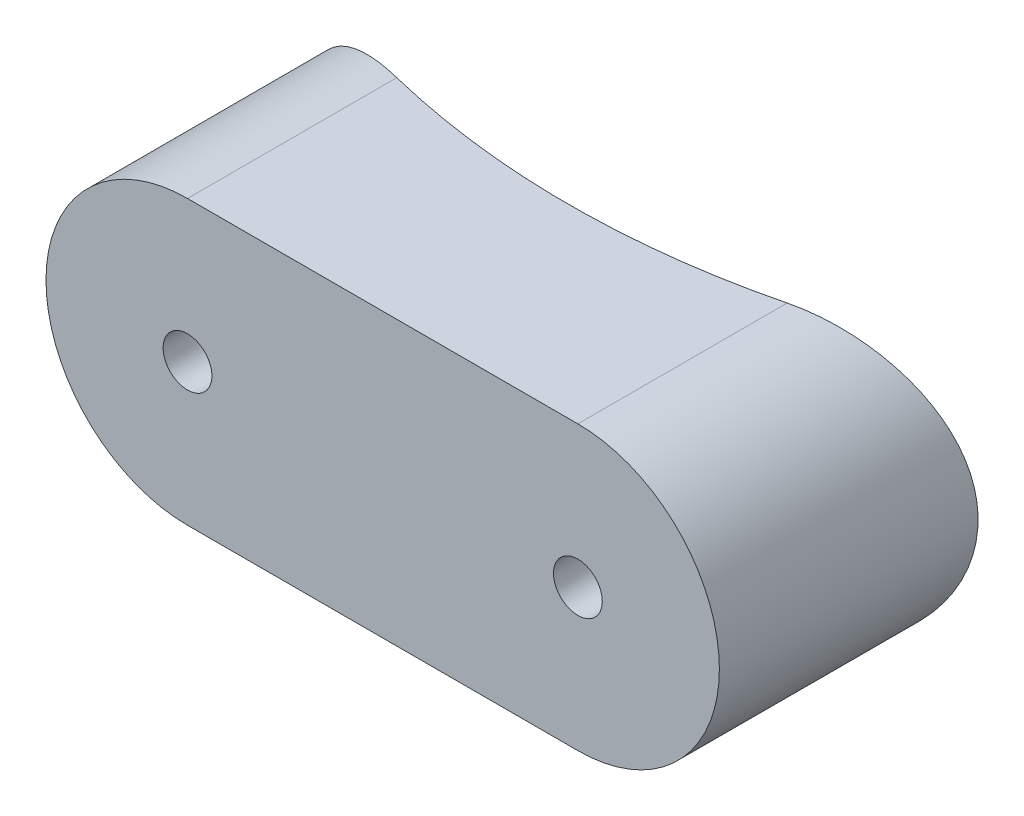
ISO-10303-21;
HEADER;
FILE_DESCRIPTION(('STEP AP214'),'2;1');
FILE_NAME('part.step','',(''),(''),'','','');
FILE_SCHEMA(('AUTOMOTIVE_DESIGN { 1 0 10303 214 1 1 1 1 }'));
ENDSEC;
DATA;
#1=APPLICATION_CONTEXT('core data for automotive mechanical design processes');
#2=APPLICATION_PROTOCOL_DEFINITION('international standard','automotive_design',2000,#1);
#3=PRODUCT_CONTEXT('',#1,'mechanical');
#4=PRODUCT('Part','Part','',(#3));
#5=PRODUCT_RELATED_PRODUCT_CATEGORY('part','',(#4));
#6=PRODUCT_DEFINITION_FORMATION('','',#4);
#7=PRODUCT_DEFINITION_CONTEXT('part definition',#1,'design');
#8=PRODUCT_DEFINITION('design','',#6,#7);
#9=PRODUCT_DEFINITION_SHAPE('','',#8);
#10=(LENGTH_UNIT() NAMED_UNIT(*) SI_UNIT(.MILLI.,.METRE.));
#11=(NAMED_UNIT(*) PLANE_ANGLE_UNIT() SI_UNIT($,.RADIAN.));
#12=(NAMED_UNIT(*) SI_UNIT($,.STERADIAN.) SOLID_ANGLE_UNIT());
#13=UNCERTAINTY_MEASURE_WITH_UNIT(LENGTH_MEASURE(1.E-05),#10,'distance_accuracy_value','');
#14=(GEOMETRIC_REPRESENTATION_CONTEXT(3) GLOBAL_UNCERTAINTY_ASSIGNED_CONTEXT((#13)) GLOBAL_UNIT_ASSIGNED_CONTEXT((#10,
#11,#12)) REPRESENTATION_CONTEXT('',''));
#15=CARTESIAN_POINT('',(0.,0.,0.));
#16=DIRECTION('',(0.,0.,1.));
#17=DIRECTION('',(1.,0.,0.));
#18=AXIS2_PLACEMENT_3D('',#15,#16,#17);
#19=CARTESIAN_POINT('',(0.,-1.15242426578704,68.));
#20=DIRECTION('',(0.,1.,0.));
#21=DIRECTION('',(-1.,0.,0.));
#22=AXIS2_PLACEMENT_3D('',#19,#20,#21);
#23=PLANE('',#22);
#24=CARTESIAN_POINT('',(0.,-1.15242426578704,31.));
#25=DIRECTION('',(0.,1.,0.));
#26=DIRECTION('',(-1.,0.,0.));
#27=AXIS2_PLACEMENT_3D('',#24,#25,#26);
#28=CIRCLE('',#27,41.5);
#29=CARTESIAN_POINT('',(9.99999999999999,-1.15242426578704,71.2771647462926));
#30=VERTEX_POINT('',#29);
#31=CARTESIAN_POINT('',(-10.,-1.15242426578704,71.2771647462926));
#32=VERTEX_POINT('',#31);
#33=EDGE_CURVE('E138',#30,#32,#28,.F.);
#34=ORIENTED_EDGE('',*,*,#33,.T.);
#35=DIRECTION('',(0.,0.,1.));
#36=VECTOR('',#35,1.);
#37=CARTESIAN_POINT('',(-10.,-1.15242426578704,68.));
#38=LINE('',#37,#36);
#39=CARTESIAN_POINT('',(-10.,-1.15242426578704,82.));
#40=VERTEX_POINT('',#39);
#41=EDGE_CURVE('E192',#32,#40,#38,.T.);
#42=ORIENTED_EDGE('',*,*,#41,.T.);
#43=DIRECTION('',(-1.,0.,0.));
#44=VECTOR('',#43,1.);
#45=CARTESIAN_POINT('',(10.,-1.15242426578704,82.));
#46=LINE('',#45,#44);
#47=CARTESIAN_POINT('',(10.,-1.15242426578704,82.));
#48=VERTEX_POINT('',#47);
#49=EDGE_CURVE('E121',#48,#40,#46,.T.);
#50=ORIENTED_EDGE('',*,*,#49,.F.);
#51=DIRECTION('',(0.,0.,1.));
#52=VECTOR('',#51,1.);
#53=CARTESIAN_POINT('',(10.,-1.15242426578704,68.));
#54=LINE('',#53,#52);
#55=EDGE_CURVE('E48',#30,#48,#54,.T.);
#56=ORIENTED_EDGE('',*,*,#55,.F.);
#57=EDGE_LOOP('',(#34,#42,#50,#56));
#58=FACE_BOUND('',#57,.T.);
#59=ADVANCED_FACE('F34',(#58),#23,.T.);
#60=CARTESIAN_POINT('',(9.99999999999999,-8.40242426578704,68.));
#61=DIRECTION('',(0.,0.,1.));
#62=DIRECTION('',(1.,0.,0.));
#63=AXIS2_PLACEMENT_3D('',#60,#61,#62);
#64=CYLINDRICAL_SURFACE('',#63,7.25);
#65=CARTESIAN_POINT('',(10.,-1.15242426578704,71.2771647462927));
#66=CARTESIAN_POINT('',(10.2124891817823,-1.1524052475028,71.2244258138282));
#67=CARTESIAN_POINT('',(10.4245300534251,-1.16176467058222,71.1699780892258));
#68=CARTESIAN_POINT('',(10.846172520077,-1.19886996710518,71.0581791388874));
#69=CARTESIAN_POINT('',(11.0557746928388,-1.22661139153719,71.000828618819));
#70=CARTESIAN_POINT('',(11.4708355233576,-1.30006355841646,70.8837871214166));
#71=CARTESIAN_POINT('',(11.6762991420345,-1.34575125151986,70.8240992342674));
#72=CARTESIAN_POINT('',(12.0819925737332,-1.45462501654705,70.7028997959157));
#73=CARTESIAN_POINT('',(12.2822221393194,-1.51781191410006,70.6413881587891));
#74=CARTESIAN_POINT('',(12.6759980911815,-1.66110354254626,70.517232615764));
#75=CARTESIAN_POINT('',(12.869548964468,-1.74119664715344,70.454589514899));
#76=CARTESIAN_POINT('',(13.2489476422076,-1.91777803441309,70.328810608568));
#77=CARTESIAN_POINT('',(13.4347925931693,-2.01427232413283,70.2656746306941));
#78=CARTESIAN_POINT('',(13.7975119153194,-2.22300796626837,70.1396924761351));
#79=CARTESIAN_POINT('',(13.9743866395916,-2.33524869822083,70.0768462881318));
#80=CARTESIAN_POINT('',(14.3180807913136,-2.57485376994829,69.9522270543036));
#81=CARTESIAN_POINT('',(14.4848967195176,-2.702223327485,69.8904543871931));
#82=CARTESIAN_POINT('',(14.8097802864001,-2.97342981741409,69.7679122347063));
#83=CARTESIAN_POINT('',(14.9676716498176,-3.11749193201401,69.7071732652072));
#84=CARTESIAN_POINT('',(15.2706547887871,-3.41960749195312,69.5886456009891));
#85=CARTESIAN_POINT('',(15.4157471170657,-3.57766033251136,69.5308567789133));
#86=CARTESIAN_POINT('',(15.6919781532452,-3.90686420682692,69.4191882406814));
#87=CARTESIAN_POINT('',(15.8231145621534,-4.07801739067678,69.3653091690517));
#88=CARTESIAN_POINT('',(16.0701655367582,-4.43226132057345,69.2624839907073));
#89=CARTESIAN_POINT('',(16.1860872215626,-4.61534642311868,69.2135355794027));
#90=CARTESIAN_POINT('',(16.3974116820319,-4.98494612853372,69.1233206528766));
#91=CARTESIAN_POINT('',(16.4934379870788,-5.1710491116763,69.0818291259539));
#92=CARTESIAN_POINT('',(16.6693917810856,-5.5518661326906,69.0051390208299));
#93=CARTESIAN_POINT('',(16.7493268602946,-5.74657605754737,68.9699374765216));
#94=CARTESIAN_POINT('',(16.8922167158571,-6.14316424865638,68.9065842268932));
#95=CARTESIAN_POINT('',(16.9551779510032,-6.34503975511669,68.8784298403206));
#96=CARTESIAN_POINT('',(17.0633762528942,-6.75438868767839,68.8298125767539));
#97=CARTESIAN_POINT('',(17.1086148384099,-6.96186163246891,68.8093490406862));
#98=CARTESIAN_POINT('',(17.1777516790101,-7.36305814135954,68.7779851047201));
#99=CARTESIAN_POINT('',(17.2031196399261,-7.55647835492858,68.7664274319373));
#100=CARTESIAN_POINT('',(17.2381852250226,-7.94502302472115,68.7504350506935));
#101=CARTESIAN_POINT('',(17.2478837866182,-8.14014737829303,68.7459999161299));
#102=CARTESIAN_POINT('',(17.2514953912304,-8.53052418792687,68.7443493766336));
#103=CARTESIAN_POINT('',(17.2454122122275,-8.72577660214531,68.7471322437882));
#104=CARTESIAN_POINT('',(17.2175410956554,-9.1149201876528,68.7598531900403));
#105=CARTESIAN_POINT('',(17.1957533938531,-9.30881137933332,68.7697911617206));
#106=CARTESIAN_POINT('',(17.1381385389307,-9.68455890977418,68.7959674062172));
#107=CARTESIAN_POINT('',(17.1030295741955,-9.86654857923512,68.8118830226414));
#108=CARTESIAN_POINT('',(17.0191490206092,-10.2267755474764,68.8497117791416));
#109=CARTESIAN_POINT('',(16.9703729869442,-10.4050116051952,68.8716268703177));
#110=CARTESIAN_POINT('',(16.8596523432354,-10.7564869432642,68.9210468282442));
#111=CARTESIAN_POINT('',(16.7977113859955,-10.9297275945526,68.9485501443655));
#112=CARTESIAN_POINT('',(16.6611892077152,-11.2703034932898,69.0086876349375));
#113=CARTESIAN_POINT('',(16.5866031832467,-11.4376364673199,69.041323758824));
#114=CARTESIAN_POINT('',(16.4226819700281,-11.7710030141406,69.1123833234679));
#115=CARTESIAN_POINT('',(16.3329307670603,-11.9367979677166,69.1509660873253));
#116=CARTESIAN_POINT('',(16.1412963576596,-12.2601854143652,69.2324389994661));
#117=CARTESIAN_POINT('',(16.0394086968998,-12.417774865166,69.2753307283172));
#118=CARTESIAN_POINT('',(15.8243009356617,-12.7238832333189,69.3647632729127));
#119=CARTESIAN_POINT('',(15.7110823788812,-12.8724033818266,69.4113035913943));
#120=CARTESIAN_POINT('',(15.4740310256327,-13.1597545157016,69.50741130914));
#121=CARTESIAN_POINT('',(15.3501944251626,-13.2985819960015,69.556979791425));
#122=CARTESIAN_POINT('',(15.0824218732578,-13.5765563185708,69.6625513270256));
#123=CARTESIAN_POINT('',(14.9376705731811,-13.7148434663978,69.7187521291568));
#124=CARTESIAN_POINT('',(14.6376921024194,-13.978642704076,69.833152570911));
#125=CARTESIAN_POINT('',(14.4824643174489,-14.1041540437374,69.8913523276436));
#126=CARTESIAN_POINT('',(14.1623833022844,-14.3418546385156,70.0090501418277));
#127=CARTESIAN_POINT('',(13.9975226381263,-14.4540333964279,70.0685491791903));
#128=CARTESIAN_POINT('',(13.6593263820418,-14.6643305992505,70.1880716415349));
#129=CARTESIAN_POINT('',(13.4859933563997,-14.7624532667951,70.2480949032597));
#130=CARTESIAN_POINT('',(13.1210603262547,-14.9496407839121,70.371653388522));
#131=CARTESIAN_POINT('',(12.9289900020856,-15.0377954884341,70.4351808482796));
#132=CARTESIAN_POINT('',(12.5377043388218,-15.1970661849329,70.5613221082055));
#133=CARTESIAN_POINT('',(12.3384914734198,-15.268188011647,70.6239362143276));
#134=CARTESIAN_POINT('',(11.934402603526,-15.3927918814357,70.7475108767652));
#135=CARTESIAN_POINT('',(11.7295335173594,-15.446294521995,70.8084732868763));
#136=CARTESIAN_POINT('',(11.3153679314694,-15.5352452733709,70.9281714709713));
#137=CARTESIAN_POINT('',(11.1060737083131,-15.5707024433158,70.9869083484749));
#138=CARTESIAN_POINT('',(10.747096666152,-15.6153746096834,71.0845793882777));
#139=CARTESIAN_POINT('',(10.5981693827144,-15.6292557690974,71.1242141881727));
#140=CARTESIAN_POINT('',(10.2995704196907,-15.6477751574909,71.2018990688261));
#141=CARTESIAN_POINT('',(10.1499001925357,-15.6524272254298,71.2399514384082));
#142=CARTESIAN_POINT('',(10.,-15.652424265787,71.2771647462927));
#143=B_SPLINE_CURVE_WITH_KNOTS('',3,(#65,#66,#67,#68,#69,#70,#71,#72,#73,#74,#75,#76,#77,#78,
#79,#80,#81,#82,#83,#84,#85,#86,#87,#88,#89,#90,#91,#92,#93,#94,#95,#96,#97,#98,#99,#100,#101,
#102,#103,#104,#105,#106,#107,#108,#109,#110,#111,#112,#113,#114,#115,#116,#117,#118,#119,#120,
#121,#122,#123,#124,#125,#126,#127,#128,#129,#130,#131,#132,#133,#134,#135,#136,#137,#138,#139,
#140,#141,#142),.UNSPECIFIED.,.F.,.F.,(4,2,2,2,2,2,2,2,2,2,2,2,2,2,2,2,2,2,2,2,2,2,2,2,2,2,2,2,
2,2,2,2,2,2,2,2,2,2,4),(0.,0.656567673122804,1.31297649462475,1.96854499766518,2.62414443632576,
3.27929448396786,3.93468500474629,4.59004970816037,5.24564109939452,5.91142236625468,
6.57717486724576,7.2430368700663,7.90858619075203,8.54820176524639,9.18751492171963,
9.82658446584179,10.4655992318922,11.0511076806693,11.6365811003617,12.2219143768916,
12.8072388661882,13.3646821209942,13.9223068787346,14.479777116708,15.0374595949773,
15.6141473363894,16.1910473898933,16.76786895445,17.3448980405414,17.968003647991,
18.5911458228465,19.2147754138662,19.8382172636966,20.4994664523586,21.1604888002166,
21.8207356221863,22.4806506614337,22.9445863499838,23.4078258427458),.UNSPECIFIED.);
#144=CARTESIAN_POINT('',(10.,-15.652424265787,71.2771647462927));
#145=VERTEX_POINT('',#144);
#146=EDGE_CURVE('E172',#30,#145,#143,.T.);
#147=ORIENTED_EDGE('',*,*,#146,.F.);
#148=ORIENTED_EDGE('',*,*,#55,.T.);
#149=CARTESIAN_POINT('',(9.99999999999999,-8.40242426578704,82.));
#150=DIRECTION('',(0.,0.,1.));
#151=DIRECTION('',(1.,0.,0.));
#152=AXIS2_PLACEMENT_3D('',#149,#150,#151);
#153=CIRCLE('',#152,7.25);
#154=CARTESIAN_POINT('',(10.,-15.652424265787,82.));
#155=VERTEX_POINT('',#154);
#156=EDGE_CURVE('E115',#155,#48,#153,.T.);
#157=ORIENTED_EDGE('',*,*,#156,.F.);
#158=DIRECTION('',(0.,0.,1.));
#159=VECTOR('',#158,1.);
#160=CARTESIAN_POINT('',(10.,-15.652424265787,68.));
#161=LINE('',#160,#159);
#162=EDGE_CURVE('E104',#145,#155,#161,.T.);
#163=ORIENTED_EDGE('',*,*,#162,.F.);
#164=EDGE_LOOP('',(#147,#148,#157,#163));
#165=FACE_BOUND('',#164,.T.);
#166=ADVANCED_FACE('F116',(#165),#64,.T.);
#167=CARTESIAN_POINT('',(0.,-15.652424265787,68.));
#168=DIRECTION('',(0.,-1.,0.));
#169=DIRECTION('',(0.,0.,-1.));
#170=AXIS2_PLACEMENT_3D('',#167,#168,#169);
#171=PLANE('',#170);
#172=CARTESIAN_POINT('',(0.,-15.652424265787,31.));
#173=DIRECTION('',(0.,-1.,0.));
#174=DIRECTION('',(0.,0.,-1.));
#175=AXIS2_PLACEMENT_3D('',#172,#173,#174);
#176=CIRCLE('',#175,41.5);
#177=CARTESIAN_POINT('',(-10.,-15.652424265787,71.2771647462927));
#178=VERTEX_POINT('',#177);
#179=EDGE_CURVE('E62',#145,#178,#176,.T.);
#180=ORIENTED_EDGE('',*,*,#179,.F.);
#181=ORIENTED_EDGE('',*,*,#162,.T.);
#182=DIRECTION('',(1.,0.,0.));
#183=VECTOR('',#182,1.);
#184=CARTESIAN_POINT('',(-10.,-15.652424265787,82.));
#185=LINE('',#184,#183);
#186=CARTESIAN_POINT('',(-10.,-15.652424265787,82.));
#187=VERTEX_POINT('',#186);
#188=EDGE_CURVE('E109',#187,#155,#185,.T.);
#189=ORIENTED_EDGE('',*,*,#188,.F.);
#190=DIRECTION('',(0.,0.,1.));
#191=VECTOR('',#190,1.);
#192=CARTESIAN_POINT('',(-10.,-15.652424265787,68.));
#193=LINE('',#192,#191);
#194=EDGE_CURVE('E112',#178,#187,#193,.T.);
#195=ORIENTED_EDGE('',*,*,#194,.F.);
#196=EDGE_LOOP('',(#180,#181,#189,#195));
#197=FACE_BOUND('',#196,.T.);
#198=ADVANCED_FACE('F106',(#197),#171,.T.);
#199=CARTESIAN_POINT('',(-10.,-8.40242426578704,68.));
#200=DIRECTION('',(0.,0.,1.));
#201=DIRECTION('',(1.,0.,0.));
#202=AXIS2_PLACEMENT_3D('',#199,#200,#201);
#203=CYLINDRICAL_SURFACE('',#202,5.25);
#204=DIRECTION('',(0.,0.,1.));
#205=VECTOR('',#204,1.);
#206=CARTESIAN_POINT('',(-10.,-13.652424265787,68.));
#207=LINE('',#206,#205);
#208=CARTESIAN_POINT('',(-10.,-13.652424265787,71.2771647462926));
#209=VERTEX_POINT('',#208);
#210=CARTESIAN_POINT('',(-10.,-13.652424265787,80.));
#211=VERTEX_POINT('',#210);
#212=EDGE_CURVE('E194',#209,#211,#207,.T.);
#213=ORIENTED_EDGE('',*,*,#212,.F.);
#214=CARTESIAN_POINT('',(-10.,-13.652424265787,71.2771647462927));
#215=CARTESIAN_POINT('',(-10.1533899755287,-13.6524376534124,71.2390904445886));
#216=CARTESIAN_POINT('',(-10.3065465809433,-13.6457026570163,71.2001255614405));
#217=CARTESIAN_POINT('',(-10.6112948439105,-13.6189530970866,71.1207553487512));
#218=CARTESIAN_POINT('',(-10.7628867457952,-13.5989406397204,71.0803502486295));
#219=CARTESIAN_POINT('',(-11.0633500999354,-13.5458720590378,70.9984570919303));
#220=CARTESIAN_POINT('',(-11.2122234060429,-13.5128252002915,70.9569698240512));
#221=CARTESIAN_POINT('',(-11.5063481155268,-13.4339841319423,70.8732657262649));
#222=CARTESIAN_POINT('',(-11.651599428602,-13.3881896048681,70.8310488782126));
#223=CARTESIAN_POINT('',(-11.9374591517484,-13.2842147794922,70.7463116918086));
#224=CARTESIAN_POINT('',(-12.0780688019741,-13.2260378209645,70.7037914382739));
#225=CARTESIAN_POINT('',(-12.3537948394166,-13.0976648783762,70.618866352627));
#226=CARTESIAN_POINT('',(-12.4889091846306,-13.0274644761111,70.5764615687859));
#227=CARTESIAN_POINT('',(-12.7526351686135,-12.8755274271508,70.4922708023637));
#228=CARTESIAN_POINT('',(-12.8812487135104,-12.7937941890142,70.4504846409647));
#229=CARTESIAN_POINT('',(-13.1311649079244,-12.6192412856608,70.368005179583));
#230=CARTESIAN_POINT('',(-13.2524650368412,-12.5264178306474,70.3273122590393));
#231=CARTESIAN_POINT('',(-13.4873413256737,-12.3298287558341,70.2473831333845));
#232=CARTESIAN_POINT('',(-13.6008813223028,-12.2260169840831,70.208154090436));
#233=CARTESIAN_POINT('',(-13.8187686247091,-12.0084206790595,70.1318918425715));
#234=CARTESIAN_POINT('',(-13.9231163126562,-11.8946365607796,70.0948585463884));
#235=CARTESIAN_POINT('',(-14.1217774020516,-11.6577808011205,70.0235383683974));
#236=CARTESIAN_POINT('',(-14.2160890958911,-11.5347075852856,69.9892519542116));
#237=CARTESIAN_POINT('',(-14.3937758085648,-11.2801514565987,69.924005134362));
#238=CARTESIAN_POINT('',(-14.4771557124322,-11.1486723393929,69.8930432442125));
#239=CARTESIAN_POINT('',(-14.6292579233522,-10.8833423499631,69.8360806088293));
#240=CARTESIAN_POINT('',(-14.6984182197091,-10.7497735496623,69.8099356100025));
#241=CARTESIAN_POINT('',(-14.8252220535894,-10.4766443810854,69.7616743063445));
#242=CARTESIAN_POINT('',(-14.8828707788216,-10.3370867462928,69.7395561871916));
#243=CARTESIAN_POINT('',(-14.9860775713446,-10.0529895971443,69.6997485905094));
#244=CARTESIAN_POINT('',(-15.0316383322215,-9.90845120078641,69.6820581264062));
#245=CARTESIAN_POINT('',(-15.1101792361978,-9.61550314141206,69.6514458267593));
#246=CARTESIAN_POINT('',(-15.1431601143021,-9.46709370511038,69.6385237126165));
#247=CARTESIAN_POINT('',(-15.1944419020108,-9.17734206098082,69.6183847656321));
#248=CARTESIAN_POINT('',(-15.2135555931147,-9.03616508275514,69.6108524881052));
#249=CARTESIAN_POINT('',(-15.2402521441773,-8.75250446535211,69.6003228319603));
#250=CARTESIAN_POINT('',(-15.2478311068456,-8.61002040089481,69.5973269860886));
#251=CARTESIAN_POINT('',(-15.2513623709479,-8.32496775322232,69.5959317688344));
#252=CARTESIAN_POINT('',(-15.247321276575,-8.18239926403972,69.5975297865557));
#253=CARTESIAN_POINT('',(-15.2276664358246,-7.89813412394121,69.6052883222101));
#254=CARTESIAN_POINT('',(-15.2120484423433,-7.75643781223327,69.6114505145566));
#255=CARTESIAN_POINT('',(-15.1701539917902,-7.4800046525268,69.6279291836241));
#256=CARTESIAN_POINT('',(-15.1442724269549,-7.3451984920455,69.6380916526854));
#257=CARTESIAN_POINT('',(-15.0821275073676,-7.07831755839583,69.6623918323051));
#258=CARTESIAN_POINT('',(-15.0458604838569,-6.94624376817231,69.6765309476189));
#259=CARTESIAN_POINT('',(-14.9632961206431,-6.68578518627998,69.7085484929201));
#260=CARTESIAN_POINT('',(-14.9170019474423,-6.55739924447863,69.72642574237));
#261=CARTESIAN_POINT('',(-14.8147656621333,-6.30502627597617,69.7656512385177));
#262=CARTESIAN_POINT('',(-14.7588199079395,-6.18104093124153,69.7870007953381));
#263=CARTESIAN_POINT('',(-14.6362651193468,-5.93526966694885,69.833415194796));
#264=CARTESIAN_POINT('',(-14.5694287911937,-5.8136116640411,69.8585581204513));
#265=CARTESIAN_POINT('',(-14.4266626653752,-5.57641106002821,69.9117876435349));
#266=CARTESIAN_POINT('',(-14.3507295227496,-5.46087073109056,69.9398753232921));
#267=CARTESIAN_POINT('',(-14.1101484208997,-5.12446073996046,70.0279747885215));
#268=CARTESIAN_POINT('',(-13.9326203539881,-4.91360597884706,70.0918608028108));
#269=CARTESIAN_POINT('',(-13.5366522524119,-4.51152305650627,70.2308001103836));
#270=CARTESIAN_POINT('',(-13.3163819838578,-4.32226540793189,70.3062960423462));
#271=CARTESIAN_POINT('',(-12.848506650475,-3.98292736554978,70.4617088995565));
#272=CARTESIAN_POINT('',(-12.6008847563325,-3.83287128547477,70.5416285314281));
#273=CARTESIAN_POINT('',(-12.207346850908,-3.63659077267556,70.6642284114045));
#274=CARTESIAN_POINT('',(-12.0688465517991,-3.57486113708424,70.7066071145453));
#275=CARTESIAN_POINT('',(-11.7869943965707,-3.46359140605474,70.7911843810841));
#276=CARTESIAN_POINT('',(-11.6436441994012,-3.41404718949613,70.8333830006288));
#277=CARTESIAN_POINT('',(-11.3532088867062,-3.32755775010862,70.9171326603668));
#278=CARTESIAN_POINT('',(-11.2061281202538,-3.29059852121542,70.9586843710252));
#279=CARTESIAN_POINT('',(-10.9091139929763,-3.22951613840302,71.0407910415774));
#280=CARTESIAN_POINT('',(-10.7591820768449,-3.20538665410799,71.0813464836045));
#281=CARTESIAN_POINT('',(-10.5074846767144,-3.17602270065064,71.1478972650993));
#282=CARTESIAN_POINT('',(-10.4062245846824,-3.16717639184706,71.1742634619897));
#283=CARTESIAN_POINT('',(-10.2033455357923,-3.15538115503863,71.2262689951227));
#284=CARTESIAN_POINT('',(-10.1017273893155,-3.15242301279475,71.2519094050395));
#285=CARTESIAN_POINT('',(-10.,-3.15242426578703,71.2771647462927));
#286=B_SPLINE_CURVE_WITH_KNOTS('',3,(#214,#215,#216,#217,#218,#219,#220,#221,#222,#223,#224,
#225,#226,#227,#228,#229,#230,#231,#232,#233,#234,#235,#236,#237,#238,#239,#240,#241,#242,#243,
#244,#245,#246,#247,#248,#249,#250,#251,#252,#253,#254,#255,#256,#257,#258,#259,#260,#261,#262,
#263,#264,#265,#266,#267,#268,#269,#270,#271,#272,#273,#274,#275,#276,#277,#278,#279,#280,#281,
#282,#283,#284,#285),.UNSPECIFIED.,.F.,.F.,(4,2,2,2,2,2,2,2,2,2,2,2,2,2,2,2,2,2,2,2,2,2,2,2,2,2,
2,2,2,2,2,2,2,2,2,4),(0.,0.473971004825246,0.94786684289269,1.42142645131372,1.89499785443996,
2.36844168797647,2.84205987066633,3.31553836637654,3.7891791264718,4.26489471513952,
4.74059051660873,5.21636712799613,5.69193040156289,6.14934205047871,6.60654709854121,
7.06365018092285,7.52072655204272,7.9481840419194,8.37578592673774,8.80314483450943,
9.23066060090712,9.64311461433313,10.0557145110501,10.4681843011404,10.8808100811647,
11.3035256579497,11.7263971499643,12.5714797674464,13.4679016028705,14.3648781072373,
14.8367578506286,15.3084777837069,15.7796710018842,16.2506315104641,16.5655034667585,
16.8798822995057),.UNSPECIFIED.);
#287=CARTESIAN_POINT('',(-10.,-3.15242426578703,71.2771647462926));
#288=VERTEX_POINT('',#287);
#289=EDGE_CURVE('E167',#209,#288,#286,.T.);
#290=ORIENTED_EDGE('',*,*,#289,.T.);
#291=DIRECTION('',(0.,0.,1.));
#292=VECTOR('',#291,1.);
#293=CARTESIAN_POINT('',(-10.,-3.15242426578704,68.));
#294=LINE('',#293,#292);
#295=CARTESIAN_POINT('',(-10.,-3.15242426578704,80.));
#296=VERTEX_POINT('',#295);
#297=EDGE_CURVE('E189',#288,#296,#294,.T.);
#298=ORIENTED_EDGE('',*,*,#297,.T.);
#299=CARTESIAN_POINT('',(-10.,-8.40242426578704,80.));
#300=DIRECTION('',(0.,0.,1.));
#301=DIRECTION('',(1.,0.,0.));
#302=AXIS2_PLACEMENT_3D('',#299,#300,#301);
#303=CIRCLE('',#302,5.25);
#304=EDGE_CURVE('E177',#296,#211,#303,.T.);
#305=ORIENTED_EDGE('',*,*,#304,.T.);
#306=EDGE_LOOP('',(#213,#290,#298,#305));
#307=FACE_BOUND('',#306,.T.);
#308=ADVANCED_FACE('F36',(#307),#203,.F.);
#309=CARTESIAN_POINT('',(0.,-13.652424265787,68.));
#310=DIRECTION('',(0.,-1.,0.));
#311=DIRECTION('',(0.,0.,-1.));
#312=AXIS2_PLACEMENT_3D('',#309,#310,#311);
#313=PLANE('',#312);
#314=DIRECTION('',(0.,0.,1.));
#315=VECTOR('',#314,1.);
#316=CARTESIAN_POINT('',(10.,-13.652424265787,68.));
#317=LINE('',#316,#315);
#318=CARTESIAN_POINT('',(10.,-13.652424265787,71.2771647462927));
#319=VERTEX_POINT('',#318);
#320=CARTESIAN_POINT('',(10.,-13.652424265787,80.));
#321=VERTEX_POINT('',#320);
#322=EDGE_CURVE('E197',#319,#321,#317,.T.);
#323=ORIENTED_EDGE('',*,*,#322,.F.);
#324=CARTESIAN_POINT('',(0.,-13.652424265787,31.));
#325=DIRECTION('',(0.,-1.,0.));
#326=DIRECTION('',(0.,0.,-1.));
#327=AXIS2_PLACEMENT_3D('',#324,#325,#326);
#328=CIRCLE('',#327,41.5);
#329=EDGE_CURVE('E148',#319,#209,#328,.T.);
#330=ORIENTED_EDGE('',*,*,#329,.T.);
#331=ORIENTED_EDGE('',*,*,#212,.T.);
#332=DIRECTION('',(1.,0.,0.));
#333=VECTOR('',#332,1.);
#334=CARTESIAN_POINT('',(0.,-13.652424265787,80.));
#335=LINE('',#334,#333);
#336=EDGE_CURVE('E186',#211,#321,#335,.T.);
#337=ORIENTED_EDGE('',*,*,#336,.T.);
#338=EDGE_LOOP('',(#323,#330,#331,#337));
#339=FACE_BOUND('',#338,.T.);
#340=ADVANCED_FACE('F213',(#339),#313,.F.);
#341=CARTESIAN_POINT('',(9.99999999999999,-8.40242426578703,68.));
#342=DIRECTION('',(0.,0.,1.));
#343=DIRECTION('',(1.,0.,0.));
#344=AXIS2_PLACEMENT_3D('',#341,#342,#343);
#345=CYLINDRICAL_SURFACE('',#344,5.25);
#346=DIRECTION('',(0.,0.,1.));
#347=VECTOR('',#346,1.);
#348=CARTESIAN_POINT('',(10.,-3.15242426578703,68.));
#349=LINE('',#348,#347);
#350=CARTESIAN_POINT('',(10.,-3.15242426578703,71.2771647462926));
#351=VERTEX_POINT('',#350);
#352=CARTESIAN_POINT('',(10.,-3.15242426578703,80.));
#353=VERTEX_POINT('',#352);
#354=EDGE_CURVE('E200',#351,#353,#349,.T.);
#355=ORIENTED_EDGE('',*,*,#354,.F.);
#356=CARTESIAN_POINT('',(10.,-3.15242426578703,71.2771647462927));
#357=CARTESIAN_POINT('',(10.1533899755287,-3.15241087816165,71.2390904445886));
#358=CARTESIAN_POINT('',(10.3065465809433,-3.15914587455775,71.2001255614405));
#359=CARTESIAN_POINT('',(10.6112948439105,-3.18589543448746,71.1207553487512));
#360=CARTESIAN_POINT('',(10.7628867457952,-3.20590789185364,71.0803502486295));
#361=CARTESIAN_POINT('',(11.0633500999354,-3.25897647253631,70.9984570919303));
#362=CARTESIAN_POINT('',(11.2122234060429,-3.29202333128256,70.9569698240512));
#363=CARTESIAN_POINT('',(11.5063481155268,-3.37086439963179,70.8732657262649));
#364=CARTESIAN_POINT('',(11.651599428602,-3.41665892670596,70.8310488782126));
#365=CARTESIAN_POINT('',(11.9374591517484,-3.52063375208185,70.7463116918086));
#366=CARTESIAN_POINT('',(12.0780688019741,-3.57881071060956,70.7037914382739));
#367=CARTESIAN_POINT('',(12.3537948394166,-3.7071836531979,70.618866352627));
#368=CARTESIAN_POINT('',(12.4889091846306,-3.77738405546298,70.5764615687859));
#369=CARTESIAN_POINT('',(12.7526351686135,-3.92932110442324,70.4922708023637));
#370=CARTESIAN_POINT('',(12.8812487135104,-4.01105434255988,70.4504846409647));
#371=CARTESIAN_POINT('',(13.1311649079244,-4.18560724591332,70.368005179583));
#372=CARTESIAN_POINT('',(13.2524650368412,-4.27843070092665,70.3273122590393));
#373=CARTESIAN_POINT('',(13.4873413256737,-4.47501977573996,70.2473831333845));
#374=CARTESIAN_POINT('',(13.6008813223028,-4.57883154749102,70.208154090436));
#375=CARTESIAN_POINT('',(13.8187686247091,-4.79642785251458,70.1318918425715));
#376=CARTESIAN_POINT('',(13.9231163126562,-4.91021197079447,70.0948585463884));
#377=CARTESIAN_POINT('',(14.1217774020516,-5.14706773045357,70.0235383683974));
#378=CARTESIAN_POINT('',(14.2160890958911,-5.2701409462885,69.9892519542116));
#379=CARTESIAN_POINT('',(14.3937758085648,-5.52469707497539,69.924005134362));
#380=CARTESIAN_POINT('',(14.4771557124322,-5.65617619218117,69.8930432442125));
#381=CARTESIAN_POINT('',(14.6292579233522,-5.92150618161099,69.8360806088293));
#382=CARTESIAN_POINT('',(14.6984182197091,-6.05507498191177,69.8099356100025));
#383=CARTESIAN_POINT('',(14.8252220535894,-6.32820415048866,69.7616743063445));
#384=CARTESIAN_POINT('',(14.8828707788216,-6.46776178528128,69.7395561871916));
#385=CARTESIAN_POINT('',(14.9860775713446,-6.75185893442978,69.6997485905094));
#386=CARTESIAN_POINT('',(15.0316383322215,-6.89639733078767,69.6820581264062));
#387=CARTESIAN_POINT('',(15.1101792361978,-7.18934539016201,69.6514458267593));
#388=CARTESIAN_POINT('',(15.1431601143021,-7.33775482646369,69.6385237126165));
#389=CARTESIAN_POINT('',(15.1944419020108,-7.62750647059325,69.6183847656321));
#390=CARTESIAN_POINT('',(15.2135555931147,-7.76868344881894,69.6108524881052));
#391=CARTESIAN_POINT('',(15.2402521441773,-8.05234406622197,69.6003228319603));
#392=CARTESIAN_POINT('',(15.2478311068456,-8.19482813067927,69.5973269860886));
#393=CARTESIAN_POINT('',(15.2513623709479,-8.47988077835176,69.5959317688344));
#394=CARTESIAN_POINT('',(15.247321276575,-8.62244926753436,69.5975297865557));
#395=CARTESIAN_POINT('',(15.2276664358245,-8.90671440763287,69.6052883222101));
#396=CARTESIAN_POINT('',(15.2120484423432,-9.04841071934081,69.6114505145566));
#397=CARTESIAN_POINT('',(15.1701539917902,-9.32484387904728,69.6279291836241));
#398=CARTESIAN_POINT('',(15.1442724269549,-9.45965003952858,69.6380916526854));
#399=CARTESIAN_POINT('',(15.0821275073676,-9.72653097317824,69.6623918323051));
#400=CARTESIAN_POINT('',(15.0458604838569,-9.85860476340176,69.6765309476189));
#401=CARTESIAN_POINT('',(14.963296120643,-10.1190633452941,69.7085484929201));
#402=CARTESIAN_POINT('',(14.9170019474422,-10.2474492870954,69.72642574237));
#403=CARTESIAN_POINT('',(14.8147656621333,-10.4998222555979,69.7656512385177));
#404=CARTESIAN_POINT('',(14.7588199079395,-10.6238076003325,69.7870007953381));
#405=CARTESIAN_POINT('',(14.6362651193467,-10.8695788646252,69.833415194796));
#406=CARTESIAN_POINT('',(14.5694287911937,-10.991236867533,69.8585581204513));
#407=CARTESIAN_POINT('',(14.4266626653752,-11.2284374715459,69.9117876435349));
#408=CARTESIAN_POINT('',(14.3507295227496,-11.3439778004835,69.9398753232921));
#409=CARTESIAN_POINT('',(14.1101484208997,-11.6803877916136,70.0279747885215));
#410=CARTESIAN_POINT('',(13.9326203539881,-11.891242552727,70.0918608028108));
#411=CARTESIAN_POINT('',(13.5366522524119,-12.2933254750678,70.2308001103836));
#412=CARTESIAN_POINT('',(13.3163819838578,-12.4825831236422,70.3062960423462));
#413=CARTESIAN_POINT('',(12.848506650475,-12.8219211660243,70.4617088995565));
#414=CARTESIAN_POINT('',(12.6008847563325,-12.9719772460993,70.5416285314281));
#415=CARTESIAN_POINT('',(12.207346850908,-13.1682577588985,70.6642284114045));
#416=CARTESIAN_POINT('',(12.068846551799,-13.2299873944898,70.7066071145454));
#417=CARTESIAN_POINT('',(11.7869943965707,-13.3412571255193,70.7911843810841));
#418=CARTESIAN_POINT('',(11.6436441994011,-13.3908013420779,70.8333830006288));
#419=CARTESIAN_POINT('',(11.3532088867061,-13.4772907814655,70.9171326603668));
#420=CARTESIAN_POINT('',(11.2061281202538,-13.5142500103587,70.9586843710252));
#421=CARTESIAN_POINT('',(10.9091139929763,-13.5753323931711,71.0407910415774));
#422=CARTESIAN_POINT('',(10.7591820768449,-13.5994618774661,71.0813464836045));
#423=CARTESIAN_POINT('',(10.5074846767144,-13.6288258309234,71.1478972650993));
#424=CARTESIAN_POINT('',(10.4062245846823,-13.637672139727,71.1742634619897));
#425=CARTESIAN_POINT('',(10.2033455357922,-13.6494673765354,71.2262689951227));
#426=CARTESIAN_POINT('',(10.1017273893155,-13.6524255187793,71.2519094050395));
#427=CARTESIAN_POINT('',(10.,-13.652424265787,71.2771647462927));
#428=B_SPLINE_CURVE_WITH_KNOTS('',3,(#356,#357,#358,#359,#360,#361,#362,#363,#364,#365,#366,
#367,#368,#369,#370,#371,#372,#373,#374,#375,#376,#377,#378,#379,#380,#381,#382,#383,#384,#385,
#386,#387,#388,#389,#390,#391,#392,#393,#394,#395,#396,#397,#398,#399,#400,#401,#402,#403,#404,
#405,#406,#407,#408,#409,#410,#411,#412,#413,#414,#415,#416,#417,#418,#419,#420,#421,#422,#423,
#424,#425,#426,#427),.UNSPECIFIED.,.F.,.F.,(4,2,2,2,2,2,2,2,2,2,2,2,2,2,2,2,2,2,2,2,2,2,2,2,2,2,
2,2,2,2,2,2,2,2,2,4),(0.,0.473971004825244,0.947866842892692,1.42142645131372,1.89499785443996,
2.36844168797646,2.84205987066633,3.31553836637654,3.7891791264718,4.26489471513952,
4.74059051660874,5.21636712799613,5.69193040156289,6.14934205047871,6.60654709854121,
7.06365018092286,7.52072655204272,7.9481840419194,8.37578592673774,8.80314483450943,
9.23066060090712,9.64311461433313,10.0557145110501,10.4681843011404,10.8808100811647,
11.3035256579497,11.7263971499643,12.5714797674464,13.4679016028705,14.3648781072373,
14.8367578506286,15.3084777837069,15.7796710018843,16.2506315104642,16.5655034667585,
16.8798822995057),.UNSPECIFIED.);
#429=EDGE_CURVE('E55',#351,#319,#428,.T.);
#430=ORIENTED_EDGE('',*,*,#429,.T.);
#431=ORIENTED_EDGE('',*,*,#322,.T.);
#432=CARTESIAN_POINT('',(9.99999999999999,-8.40242426578703,80.));
#433=DIRECTION('',(0.,0.,1.));
#434=DIRECTION('',(1.,0.,0.));
#435=AXIS2_PLACEMENT_3D('',#432,#433,#434);
#436=CIRCLE('',#435,5.25);
#437=EDGE_CURVE('E183',#321,#353,#436,.T.);
#438=ORIENTED_EDGE('',*,*,#437,.T.);
#439=EDGE_LOOP('',(#355,#430,#431,#438));
#440=FACE_BOUND('',#439,.T.);
#441=ADVANCED_FACE('F150',(#440),#345,.F.);
#442=CARTESIAN_POINT('',(0.,-3.15242426578703,68.));
#443=DIRECTION('',(0.,1.,0.));
#444=DIRECTION('',(-1.,0.,0.));
#445=AXIS2_PLACEMENT_3D('',#442,#443,#444);
#446=PLANE('',#445);
#447=ORIENTED_EDGE('',*,*,#297,.F.);
#448=CARTESIAN_POINT('',(0.,-3.15242426578703,31.));
#449=DIRECTION('',(0.,1.,0.));
#450=DIRECTION('',(-1.,0.,0.));
#451=AXIS2_PLACEMENT_3D('',#448,#449,#450);
#452=CIRCLE('',#451,41.5);
#453=EDGE_CURVE('E141',#288,#351,#452,.T.);
#454=ORIENTED_EDGE('',*,*,#453,.T.);
#455=ORIENTED_EDGE('',*,*,#354,.T.);
#456=DIRECTION('',(-1.,0.,0.));
#457=VECTOR('',#456,1.);
#458=CARTESIAN_POINT('',(0.,-3.15242426578703,80.));
#459=LINE('',#458,#457);
#460=EDGE_CURVE('E180',#353,#296,#459,.T.);
#461=ORIENTED_EDGE('',*,*,#460,.T.);
#462=EDGE_LOOP('',(#447,#454,#455,#461));
#463=FACE_BOUND('',#462,.T.);
#464=ADVANCED_FACE('F207',(#463),#446,.F.);
#465=CARTESIAN_POINT('',(-10.,-8.40242426578704,68.));
#466=DIRECTION('',(0.,0.,1.));
#467=DIRECTION('',(1.,0.,0.));
#468=AXIS2_PLACEMENT_3D('',#465,#466,#467);
#469=CYLINDRICAL_SURFACE('',#468,7.25);
#470=CARTESIAN_POINT('',(-10.,-15.652424265787,71.2771647462927));
#471=CARTESIAN_POINT('',(-10.2124891817823,-15.6524432840713,71.2244258138282));
#472=CARTESIAN_POINT('',(-10.4245300534251,-15.6430838609919,71.1699780892258));
#473=CARTESIAN_POINT('',(-10.846172520077,-15.6059785644689,71.0581791388874));
#474=CARTESIAN_POINT('',(-11.0557746928388,-15.5782371400369,71.000828618819));
#475=CARTESIAN_POINT('',(-11.4708355233576,-15.5047849731576,70.8837871214166));
#476=CARTESIAN_POINT('',(-11.6762991420345,-15.4590972800542,70.8240992342674));
#477=CARTESIAN_POINT('',(-12.0819925737332,-15.350223515027,70.7028997959157));
#478=CARTESIAN_POINT('',(-12.2822221393194,-15.287036617474,70.6413881587891));
#479=CARTESIAN_POINT('',(-12.6759980911815,-15.1437449890278,70.517232615764));
#480=CARTESIAN_POINT('',(-12.869548964468,-15.0636518844206,70.454589514899));
#481=CARTESIAN_POINT('',(-13.2489476422076,-14.887070497161,70.328810608568));
#482=CARTESIAN_POINT('',(-13.4347925931693,-14.7905762074413,70.2656746306941));
#483=CARTESIAN_POINT('',(-13.7975119153194,-14.5818405653057,70.1396924761351));
#484=CARTESIAN_POINT('',(-13.9743866395916,-14.4695998333533,70.0768462881318));
#485=CARTESIAN_POINT('',(-14.3180807913136,-14.2299947616258,69.9522270543036));
#486=CARTESIAN_POINT('',(-14.4848967195176,-14.1026252040891,69.8904543871931));
#487=CARTESIAN_POINT('',(-14.8097802864001,-13.83141871416,69.7679122347063));
#488=CARTESIAN_POINT('',(-14.9676716498176,-13.6873565995601,69.7071732652072));
#489=CARTESIAN_POINT('',(-15.2706547887871,-13.385241039621,69.5886456009891));
#490=CARTESIAN_POINT('',(-15.4157471170657,-13.2271881990627,69.5308567789133));
#491=CARTESIAN_POINT('',(-15.6919781532452,-12.8979843247472,69.4191882406814));
#492=CARTESIAN_POINT('',(-15.8231145621534,-12.7268311408973,69.3653091690517));
#493=CARTESIAN_POINT('',(-16.0701655367582,-12.3725872110006,69.2624839907073));
#494=CARTESIAN_POINT('',(-16.1860872215626,-12.1895021084554,69.2135355794027));
#495=CARTESIAN_POINT('',(-16.3974116820319,-11.8199024030404,69.1233206528766));
#496=CARTESIAN_POINT('',(-16.4934379870788,-11.6337994198978,69.0818291259539));
#497=CARTESIAN_POINT('',(-16.6693917810856,-11.2529823988835,69.0051390208299));
#498=CARTESIAN_POINT('',(-16.7493268602946,-11.0582724740267,68.9699374765216));
#499=CARTESIAN_POINT('',(-16.8922167158571,-10.6616842829177,68.9065842268932));
#500=CARTESIAN_POINT('',(-16.9551779510032,-10.4598087764574,68.8784298403206));
#501=CARTESIAN_POINT('',(-17.0633762528942,-10.0504598438957,68.8298125767539));
#502=CARTESIAN_POINT('',(-17.1086148384099,-9.84298689910517,68.8093490406862));
#503=CARTESIAN_POINT('',(-17.1777516790101,-9.44179039021454,68.77798510472));
#504=CARTESIAN_POINT('',(-17.2031196399261,-9.2483701766455,68.7664274319373));
#505=CARTESIAN_POINT('',(-17.2381852250226,-8.85982550685293,68.7504350506935));
#506=CARTESIAN_POINT('',(-17.2478837866182,-8.66470115328105,68.7459999161299));
#507=CARTESIAN_POINT('',(-17.2514953912304,-8.27432434364721,68.7443493766336));
#508=CARTESIAN_POINT('',(-17.2454122122275,-8.07907192942877,68.7471322437882));
#509=CARTESIAN_POINT('',(-17.2175410956555,-7.68992834392128,68.7598531900403));
#510=CARTESIAN_POINT('',(-17.1957533938531,-7.49603715224077,68.7697911617206));
#511=CARTESIAN_POINT('',(-17.1381385389307,-7.12028962179991,68.7959674062172));
#512=CARTESIAN_POINT('',(-17.1030295741955,-6.93829995233896,68.8118830226414));
#513=CARTESIAN_POINT('',(-17.0191490206092,-6.57807298409769,68.8497117791416));
#514=CARTESIAN_POINT('',(-16.9703729869442,-6.39983692637887,68.8716268703177));
#515=CARTESIAN_POINT('',(-16.8596523432354,-6.04836158830992,68.9210468282442));
#516=CARTESIAN_POINT('',(-16.7977113859955,-5.87512093702145,68.9485501443655));
#517=CARTESIAN_POINT('',(-16.6611892077152,-5.53454503828428,69.0086876349374));
#518=CARTESIAN_POINT('',(-16.5866031832467,-5.36721206425423,69.041323758824));
#519=CARTESIAN_POINT('',(-16.4226819700282,-5.03384551743351,69.1123833234679));
#520=CARTESIAN_POINT('',(-16.3329307670604,-4.86805056385749,69.1509660873253));
#521=CARTESIAN_POINT('',(-16.1412963576596,-4.5446631172089,69.2324389994661));
#522=CARTESIAN_POINT('',(-16.0394086968998,-4.38707366640804,69.2753307283172));
#523=CARTESIAN_POINT('',(-15.8243009356618,-4.08096529825517,69.3647632729127));
#524=CARTESIAN_POINT('',(-15.7110823788812,-3.93244514974749,69.4113035913942));
#525=CARTESIAN_POINT('',(-15.4740310256327,-3.64509401587252,69.50741130914));
#526=CARTESIAN_POINT('',(-15.3501944251626,-3.5062665355726,69.556979791425));
#527=CARTESIAN_POINT('',(-15.0824218732579,-3.22829221300328,69.6625513270256));
#528=CARTESIAN_POINT('',(-14.9376705731811,-3.09000506517629,69.7187521291568));
#529=CARTESIAN_POINT('',(-14.6376921024194,-2.82620582749806,69.833152570911));
#530=CARTESIAN_POINT('',(-14.4824643174489,-2.70069448783666,69.8913523276436));
#531=CARTESIAN_POINT('',(-14.1623833022845,-2.46299389305846,70.0090501418277));
#532=CARTESIAN_POINT('',(-13.9975226381263,-2.3508151351462,70.0685491791903));
#533=CARTESIAN_POINT('',(-13.6593263820419,-2.14051793232361,70.1880716415349));
#534=CARTESIAN_POINT('',(-13.4859933563997,-2.04239526477901,70.2480949032597));
#535=CARTESIAN_POINT('',(-13.1210603262547,-1.85520774766198,70.371653388522));
#536=CARTESIAN_POINT('',(-12.9289900020856,-1.76705304313994,70.4351808482796));
#537=CARTESIAN_POINT('',(-12.5377043388218,-1.60778234664114,70.5613221082055));
#538=CARTESIAN_POINT('',(-12.3384914734198,-1.53666051992711,70.6239362143276));
#539=CARTESIAN_POINT('',(-11.934402603526,-1.41205665013841,70.7475108767651));
#540=CARTESIAN_POINT('',(-11.7295335173594,-1.35855400957903,70.8084732868763));
#541=CARTESIAN_POINT('',(-11.3153679314694,-1.26960325820321,70.9281714709713));
#542=CARTESIAN_POINT('',(-11.1060737083131,-1.23414608825829,70.9869083484749));
#543=CARTESIAN_POINT('',(-10.7470966661521,-1.18947392189064,71.0845793882777));
#544=CARTESIAN_POINT('',(-10.5981693827144,-1.17559276247669,71.1242141881727));
#545=CARTESIAN_POINT('',(-10.2995704196907,-1.15707337408317,71.2018990688261));
#546=CARTESIAN_POINT('',(-10.1499001925357,-1.15242130614423,71.2399514384082));
#547=CARTESIAN_POINT('',(-10.,-1.15242426578704,71.2771647462927));
#548=B_SPLINE_CURVE_WITH_KNOTS('',3,(#470,#471,#472,#473,#474,#475,#476,#477,#478,#479,#480,
#481,#482,#483,#484,#485,#486,#487,#488,#489,#490,#491,#492,#493,#494,#495,#496,#497,#498,#499,
#500,#501,#502,#503,#504,#505,#506,#507,#508,#509,#510,#511,#512,#513,#514,#515,#516,#517,#518,
#519,#520,#521,#522,#523,#524,#525,#526,#527,#528,#529,#530,#531,#532,#533,#534,#535,#536,#537,
#538,#539,#540,#541,#542,#543,#544,#545,#546,#547),.UNSPECIFIED.,.F.,.F.,(4,2,2,2,2,2,2,2,2,2,2,
2,2,2,2,2,2,2,2,2,2,2,2,2,2,2,2,2,2,2,2,2,2,2,2,2,2,2,4),(0.,0.656567673122806,1.31297649462475,
1.96854499766518,2.62414443632576,3.27929448396785,3.93468500474629,4.59004970816037,
5.24564109939452,5.91142236625468,6.57717486724576,7.2430368700663,7.90858619075203,
8.5482017652464,9.18751492171964,9.8265844658418,10.4655992318922,11.0511076806693,
11.6365811003617,12.2219143768916,12.8072388661882,13.3646821209942,13.9223068787346,
14.479777116708,15.0374595949773,15.6141473363894,16.1910473898933,16.76786895445,
17.3448980405414,17.968003647991,18.5911458228465,19.2147754138662,19.8382172636966,
20.4994664523586,21.1604888002166,21.8207356221863,22.4806506614337,22.9445863499838,
23.4078258427458),.UNSPECIFIED.);
#549=EDGE_CURVE('E11',#178,#32,#548,.T.);
#550=ORIENTED_EDGE('',*,*,#549,.F.);
#551=ORIENTED_EDGE('',*,*,#194,.T.);
#552=CARTESIAN_POINT('',(-10.,-8.40242426578704,82.));
#553=DIRECTION('',(0.,0.,1.));
#554=DIRECTION('',(1.,0.,0.));
#555=AXIS2_PLACEMENT_3D('',#552,#553,#554);
#556=CIRCLE('',#555,7.25);
#557=EDGE_CURVE('E127',#40,#187,#556,.T.);
#558=ORIENTED_EDGE('',*,*,#557,.F.);
#559=ORIENTED_EDGE('',*,*,#41,.F.);
#560=EDGE_LOOP('',(#550,#551,#558,#559));
#561=FACE_BOUND('',#560,.T.);
#562=ADVANCED_FACE('F159',(#561),#469,.T.);
#563=CARTESIAN_POINT('',(0.,48.139213245707,31.));
#564=DIRECTION('',(0.,-1.,0.));
#565=DIRECTION('',(0.,0.,-1.));
#566=AXIS2_PLACEMENT_3D('',#563,#564,#565);
#567=CYLINDRICAL_SURFACE('',#566,41.5);
#568=ORIENTED_EDGE('',*,*,#146,.T.);
#569=ORIENTED_EDGE('',*,*,#179,.T.);
#570=ORIENTED_EDGE('',*,*,#549,.T.);
#571=ORIENTED_EDGE('',*,*,#33,.F.);
#572=EDGE_LOOP('',(#568,#569,#570,#571));
#573=FACE_BOUND('',#572,.T.);
#574=ORIENTED_EDGE('',*,*,#329,.F.);
#575=ORIENTED_EDGE('',*,*,#429,.F.);
#576=ORIENTED_EDGE('',*,*,#453,.F.);
#577=ORIENTED_EDGE('',*,*,#289,.F.);
#578=EDGE_LOOP('',(#574,#575,#576,#577));
#579=FACE_BOUND('',#578,.T.);
#580=ADVANCED_FACE('F153',(#573,#579),#567,.F.);
#581=CARTESIAN_POINT('',(9.99999999999999,-8.40242426578704,80.));
#582=DIRECTION('',(0.,0.,1.));
#583=DIRECTION('',(1.,0.,0.));
#584=AXIS2_PLACEMENT_3D('',#581,#582,#583);
#585=PLANE('',#584);
#586=CARTESIAN_POINT('',(-10.,-8.40242426578704,80.));
#587=DIRECTION('',(0.,0.,1.));
#588=DIRECTION('',(1.,0.,0.));
#589=AXIS2_PLACEMENT_3D('',#586,#587,#588);
#590=CIRCLE('',#589,1.25);
#591=CARTESIAN_POINT('',(-8.75,-8.40242426578704,80.));
#592=VERTEX_POINT('',#591);
#593=EDGE_CURVE('E320',#592,#592,#590,.T.);
#594=ORIENTED_EDGE('',*,*,#593,.T.);
#595=EDGE_LOOP('',(#594));
#596=FACE_BOUND('',#595,.T.);
#597=CARTESIAN_POINT('',(9.99999999999999,-8.40242426578703,80.));
#598=DIRECTION('',(0.,0.,1.));
#599=DIRECTION('',(1.,0.,0.));
#600=AXIS2_PLACEMENT_3D('',#597,#598,#599);
#601=CIRCLE('',#600,1.25);
#602=CARTESIAN_POINT('',(11.25,-8.40242426578703,80.));
#603=VERTEX_POINT('',#602);
#604=EDGE_CURVE('E131',#603,#603,#601,.T.);
#605=ORIENTED_EDGE('',*,*,#604,.T.);
#606=EDGE_LOOP('',(#605));
#607=FACE_BOUND('',#606,.T.);
#608=ORIENTED_EDGE('',*,*,#336,.F.);
#609=ORIENTED_EDGE('',*,*,#304,.F.);
#610=ORIENTED_EDGE('',*,*,#460,.F.);
#611=ORIENTED_EDGE('',*,*,#437,.F.);
#612=EDGE_LOOP('',(#608,#609,#610,#611));
#613=FACE_BOUND('',#612,.T.);
#614=ADVANCED_FACE('F158',(#596,#607,#613),#585,.F.);
#615=CARTESIAN_POINT('',(9.99999999999999,-8.40242426578704,82.));
#616=DIRECTION('',(0.,0.,1.));
#617=DIRECTION('',(1.,0.,0.));
#618=AXIS2_PLACEMENT_3D('',#615,#616,#617);
#619=PLANE('',#618);
#620=CARTESIAN_POINT('',(9.99999999999999,-8.40242426578703,82.));
#621=DIRECTION('',(0.,0.,1.));
#622=DIRECTION('',(1.,0.,0.));
#623=AXIS2_PLACEMENT_3D('',#620,#621,#622);
#624=CIRCLE('',#623,1.25);
#625=CARTESIAN_POINT('',(11.25,-8.40242426578703,82.));
#626=VERTEX_POINT('',#625);
#627=EDGE_CURVE('E128',#626,#626,#624,.T.);
#628=ORIENTED_EDGE('',*,*,#627,.F.);
#629=EDGE_LOOP('',(#628));
#630=FACE_BOUND('',#629,.T.);
#631=ORIENTED_EDGE('',*,*,#188,.T.);
#632=ORIENTED_EDGE('',*,*,#156,.T.);
#633=ORIENTED_EDGE('',*,*,#49,.T.);
#634=ORIENTED_EDGE('',*,*,#557,.T.);
#635=EDGE_LOOP('',(#631,#632,#633,#634));
#636=FACE_BOUND('',#635,.T.);
#637=CARTESIAN_POINT('',(-10.,-8.40242426578704,82.));
#638=DIRECTION('',(0.,0.,1.));
#639=DIRECTION('',(1.,0.,0.));
#640=AXIS2_PLACEMENT_3D('',#637,#638,#639);
#641=CIRCLE('',#640,1.25);
#642=CARTESIAN_POINT('',(-8.75,-8.40242426578704,82.));
#643=VERTEX_POINT('',#642);
#644=EDGE_CURVE('E317',#643,#643,#641,.T.);
#645=ORIENTED_EDGE('',*,*,#644,.F.);
#646=EDGE_LOOP('',(#645));
#647=FACE_BOUND('',#646,.T.);
#648=ADVANCED_FACE('F124',(#630,#636,#647),#619,.T.);
#649=CARTESIAN_POINT('',(9.99999999999999,-8.40242426578703,82.));
#650=DIRECTION('',(0.,0.,-1.));
#651=DIRECTION('',(-1.,0.,0.));
#652=AXIS2_PLACEMENT_3D('',#649,#650,#651);
#653=CYLINDRICAL_SURFACE('',#652,1.25);
#654=ORIENTED_EDGE('',*,*,#627,.T.);
#655=EDGE_LOOP('',(#654));
#656=FACE_BOUND('',#655,.T.);
#657=ORIENTED_EDGE('',*,*,#604,.F.);
#658=EDGE_LOOP('',(#657));
#659=FACE_BOUND('',#658,.T.);
#660=ADVANCED_FACE('F289',(#656,#659),#653,.F.);
#661=CARTESIAN_POINT('',(-10.,-8.40242426578704,82.));
#662=DIRECTION('',(0.,0.,-1.));
#663=DIRECTION('',(-1.,0.,0.));
#664=AXIS2_PLACEMENT_3D('',#661,#662,#663);
#665=CYLINDRICAL_SURFACE('',#664,1.25);
#666=ORIENTED_EDGE('',*,*,#644,.T.);
#667=EDGE_LOOP('',(#666));
#668=FACE_BOUND('',#667,.T.);
#669=ORIENTED_EDGE('',*,*,#593,.F.);
#670=EDGE_LOOP('',(#669));
#671=FACE_BOUND('',#670,.T.);
#672=ADVANCED_FACE('F301',(#668,#671),#665,.F.);
#673=CLOSED_SHELL('',(#59,#166,#198,#308,#340,#441,#464,#562,#580,#614,#648,#660,#672));
#674=MANIFOLD_SOLID_BREP('B2',#673);
#675=ADVANCED_BREP_SHAPE_REPRESENTATION('',(#18,#674),#14);
#676=SHAPE_DEFINITION_REPRESENTATION(#9,#675);
ENDSEC;
END-ISO-10303-21;
